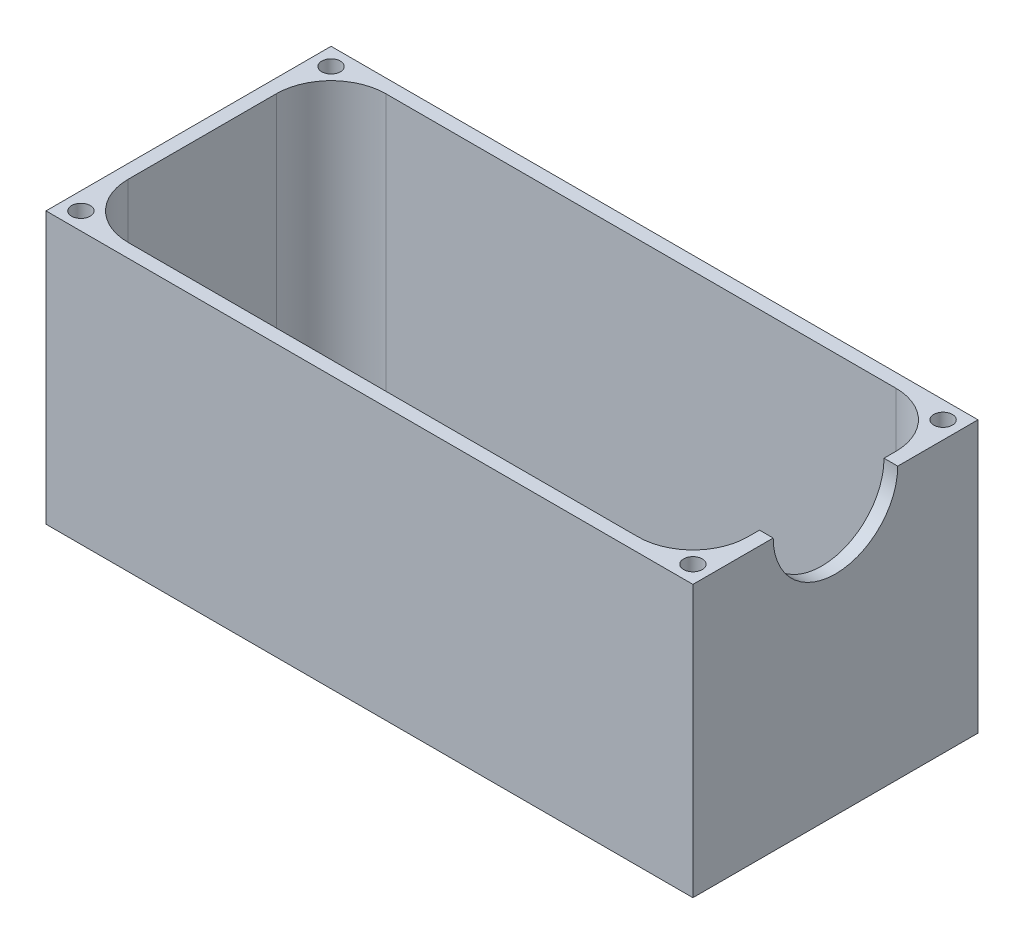
ISO-10303-21;
HEADER;
FILE_DESCRIPTION(('STEP AP214'),'2;1');
FILE_NAME('part.step','',(''),(''),'','','');
FILE_SCHEMA(('AUTOMOTIVE_DESIGN { 1 0 10303 214 1 1 1 1 }'));
ENDSEC;
DATA;
#1=APPLICATION_CONTEXT('core data for automotive mechanical design processes');
#2=APPLICATION_PROTOCOL_DEFINITION('international standard','automotive_design',2000,#1);
#3=PRODUCT_CONTEXT('',#1,'mechanical');
#4=PRODUCT('Part','Part','',(#3));
#5=PRODUCT_RELATED_PRODUCT_CATEGORY('part','',(#4));
#6=PRODUCT_DEFINITION_FORMATION('','',#4);
#7=PRODUCT_DEFINITION_CONTEXT('part definition',#1,'design');
#8=PRODUCT_DEFINITION('design','',#6,#7);
#9=PRODUCT_DEFINITION_SHAPE('','',#8);
#10=(LENGTH_UNIT() NAMED_UNIT(*) SI_UNIT(.MILLI.,.METRE.));
#11=(NAMED_UNIT(*) PLANE_ANGLE_UNIT() SI_UNIT($,.RADIAN.));
#12=(NAMED_UNIT(*) SI_UNIT($,.STERADIAN.) SOLID_ANGLE_UNIT());
#13=UNCERTAINTY_MEASURE_WITH_UNIT(LENGTH_MEASURE(1.E-05),#10,'distance_accuracy_value','');
#14=(GEOMETRIC_REPRESENTATION_CONTEXT(3) GLOBAL_UNCERTAINTY_ASSIGNED_CONTEXT((#13)) GLOBAL_UNIT_ASSIGNED_CONTEXT((#10,
#11,#12)) REPRESENTATION_CONTEXT('',''));
#15=CARTESIAN_POINT('',(0.,0.,0.));
#16=DIRECTION('',(0.,0.,1.));
#17=DIRECTION('',(1.,0.,0.));
#18=AXIS2_PLACEMENT_3D('',#15,#16,#17);
#19=CARTESIAN_POINT('',(0.,49.5,0.));
#20=DIRECTION('',(0.,1.,0.));
#21=DIRECTION('',(0.,0.,1.));
#22=AXIS2_PLACEMENT_3D('',#19,#20,#21);
#23=PLANE('',#22);
#24=CARTESIAN_POINT('',(-48.9246347305163,49.5,-29.3451864675237));
#25=DIRECTION('',(0.,-1.,0.));
#26=DIRECTION('',(0.,0.,-1.));
#27=AXIS2_PLACEMENT_3D('',#24,#25,#26);
#28=CIRCLE('',#27,1.7);
#29=CARTESIAN_POINT('',(-48.9246347305163,49.5,-31.0451864675237));
#30=VERTEX_POINT('',#29);
#31=EDGE_CURVE('E485',#30,#30,#28,.T.);
#32=ORIENTED_EDGE('',*,*,#31,.T.);
#33=EDGE_LOOP('',(#32));
#34=FACE_BOUND('',#33,.T.);
#35=CARTESIAN_POINT('',(-48.9246347305163,49.5,16.2908525017974));
#36=DIRECTION('',(0.,1.,0.));
#37=DIRECTION('',(0.,0.,1.));
#38=AXIS2_PLACEMENT_3D('',#35,#36,#37);
#39=CIRCLE('',#38,1.7);
#40=CARTESIAN_POINT('',(-48.9246347305163,49.5,17.9908525017974));
#41=VERTEX_POINT('',#40);
#42=EDGE_CURVE('E483',#41,#41,#39,.T.);
#43=ORIENTED_EDGE('',*,*,#42,.F.);
#44=EDGE_LOOP('',(#43));
#45=FACE_BOUND('',#44,.T.);
#46=DIRECTION('',(1.,0.,0.));
#47=VECTOR('',#46,1.);
#48=CARTESIAN_POINT('',(23.3933847541442,49.5,4.83194231702574));
#49=LINE('',#48,#47);
#50=CARTESIAN_POINT('',(63.3933847541442,49.5,4.83194231702574));
#51=VERTEX_POINT('',#50);
#52=CARTESIAN_POINT('',(65.8933847541443,49.5,4.83194231702574));
#53=VERTEX_POINT('',#52);
#54=EDGE_CURVE('E159',#51,#53,#49,.T.);
#55=ORIENTED_EDGE('',*,*,#54,.F.);
#56=DIRECTION('',(0.,0.,-1.));
#57=VECTOR('',#56,1.);
#58=CARTESIAN_POINT('',(63.3933847541442,49.5,-32.5271669828632));
#59=LINE('',#58,#57);
#60=CARTESIAN_POINT('',(63.3933847541442,49.5,6.97283301713683));
#61=VERTEX_POINT('',#60);
#62=EDGE_CURVE('E254',#61,#51,#59,.T.);
#63=ORIENTED_EDGE('',*,*,#62,.F.);
#64=CARTESIAN_POINT('',(53.3933847541442,49.5,6.97283301713683));
#65=DIRECTION('',(0.,1.,0.));
#66=DIRECTION('',(0.,0.,1.));
#67=AXIS2_PLACEMENT_3D('',#64,#65,#66);
#68=CIRCLE('',#67,10.);
#69=CARTESIAN_POINT('',(53.3933847541442,49.5,16.9728330171368));
#70=VERTEX_POINT('',#69);
#71=EDGE_CURVE('E235',#61,#70,#68,.F.);
#72=ORIENTED_EDGE('',*,*,#71,.T.);
#73=DIRECTION('',(1.,0.,0.));
#74=VECTOR('',#73,1.);
#75=CARTESIAN_POINT('',(-52.1066152458557,49.5,16.9728330171368));
#76=LINE('',#75,#74);
#77=CARTESIAN_POINT('',(-39.6066152458557,49.5,16.9728330171368));
#78=VERTEX_POINT('',#77);
#79=EDGE_CURVE('E335',#78,#70,#76,.T.);
#80=ORIENTED_EDGE('',*,*,#79,.F.);
#81=CARTESIAN_POINT('',(-39.6066152458557,49.5,6.97283301713683));
#82=DIRECTION('',(0.,1.,0.));
#83=DIRECTION('',(0.,0.,1.));
#84=AXIS2_PLACEMENT_3D('',#81,#82,#83);
#85=CIRCLE('',#84,10.);
#86=CARTESIAN_POINT('',(-49.6066152458557,49.5,6.97283301713683));
#87=VERTEX_POINT('',#86);
#88=EDGE_CURVE('E65',#78,#87,#85,.F.);
#89=ORIENTED_EDGE('',*,*,#88,.T.);
#90=DIRECTION('',(0.,0.,1.));
#91=VECTOR('',#90,1.);
#92=CARTESIAN_POINT('',(-49.6066152458557,49.5,-32.5271669828632));
#93=LINE('',#92,#91);
#94=CARTESIAN_POINT('',(-49.6066152458557,49.5,-20.0271669828632));
#95=VERTEX_POINT('',#94);
#96=EDGE_CURVE('E245',#95,#87,#93,.T.);
#97=ORIENTED_EDGE('',*,*,#96,.F.);
#98=CARTESIAN_POINT('',(-39.6066152458557,49.5,-20.0271669828632));
#99=DIRECTION('',(0.,1.,0.));
#100=DIRECTION('',(0.,0.,1.));
#101=AXIS2_PLACEMENT_3D('',#98,#99,#100);
#102=CIRCLE('',#101,10.);
#103=CARTESIAN_POINT('',(-39.6066152458557,49.5,-30.0271669828632));
#104=VERTEX_POINT('',#103);
#105=EDGE_CURVE('E239',#95,#104,#102,.F.);
#106=ORIENTED_EDGE('',*,*,#105,.T.);
#107=DIRECTION('',(-1.,0.,0.));
#108=VECTOR('',#107,1.);
#109=CARTESIAN_POINT('',(-52.1066152458557,49.5,-30.0271669828632));
#110=LINE('',#109,#108);
#111=CARTESIAN_POINT('',(53.3933847541442,49.5,-30.0271669828632));
#112=VERTEX_POINT('',#111);
#113=EDGE_CURVE('E243',#112,#104,#110,.T.);
#114=ORIENTED_EDGE('',*,*,#113,.F.);
#115=CARTESIAN_POINT('',(53.3933847541442,49.5,-20.0271669828632));
#116=DIRECTION('',(0.,1.,0.));
#117=DIRECTION('',(0.,0.,1.));
#118=AXIS2_PLACEMENT_3D('',#115,#116,#117);
#119=CIRCLE('',#118,10.);
#120=CARTESIAN_POINT('',(63.3933847541442,49.5,-20.0271669828632));
#121=VERTEX_POINT('',#120);
#122=EDGE_CURVE('E237',#112,#121,#119,.F.);
#123=ORIENTED_EDGE('',*,*,#122,.T.);
#124=CARTESIAN_POINT('',(63.3933847541442,49.5,-17.8862762827521));
#125=VERTEX_POINT('',#124);
#126=EDGE_CURVE('E172',#125,#121,#59,.T.);
#127=ORIENTED_EDGE('',*,*,#126,.F.);
#128=DIRECTION('',(1.,0.,0.));
#129=VECTOR('',#128,1.);
#130=CARTESIAN_POINT('',(23.3933847541442,49.5,-17.8862762827521));
#131=LINE('',#130,#129);
#132=CARTESIAN_POINT('',(65.8933847541443,49.5,-17.8862762827521));
#133=VERTEX_POINT('',#132);
#134=EDGE_CURVE('E71',#125,#133,#131,.T.);
#135=ORIENTED_EDGE('',*,*,#134,.T.);
#136=DIRECTION('',(0.,0.,-1.));
#137=VECTOR('',#136,1.);
#138=CARTESIAN_POINT('',(65.8933847541443,49.5,-32.5271669828632));
#139=LINE('',#138,#137);
#140=CARTESIAN_POINT('',(65.8933847541443,49.5,-32.5271669828632));
#141=VERTEX_POINT('',#140);
#142=EDGE_CURVE('E169',#133,#141,#139,.T.);
#143=ORIENTED_EDGE('',*,*,#142,.T.);
#144=DIRECTION('',(-1.,0.,0.));
#145=VECTOR('',#144,1.);
#146=CARTESIAN_POINT('',(-52.1066152458557,49.5,-32.5271669828632));
#147=LINE('',#146,#145);
#148=CARTESIAN_POINT('',(-52.1066152458557,49.5,-32.5271669828632));
#149=VERTEX_POINT('',#148);
#150=EDGE_CURVE('E181',#141,#149,#147,.T.);
#151=ORIENTED_EDGE('',*,*,#150,.T.);
#152=DIRECTION('',(0.,0.,1.));
#153=VECTOR('',#152,1.);
#154=CARTESIAN_POINT('',(-52.1066152458557,49.5,-32.5271669828632));
#155=LINE('',#154,#153);
#156=CARTESIAN_POINT('',(-52.1066152458557,49.5,19.4728330171368));
#157=VERTEX_POINT('',#156);
#158=EDGE_CURVE('E183',#149,#157,#155,.T.);
#159=ORIENTED_EDGE('',*,*,#158,.T.);
#160=DIRECTION('',(1.,0.,0.));
#161=VECTOR('',#160,1.);
#162=CARTESIAN_POINT('',(-52.1066152458557,49.5,19.4728330171368));
#163=LINE('',#162,#161);
#164=CARTESIAN_POINT('',(65.8933847541443,49.5,19.4728330171368));
#165=VERTEX_POINT('',#164);
#166=EDGE_CURVE('E179',#157,#165,#163,.T.);
#167=ORIENTED_EDGE('',*,*,#166,.T.);
#168=EDGE_CURVE('E178',#165,#53,#139,.T.);
#169=ORIENTED_EDGE('',*,*,#168,.T.);
#170=EDGE_LOOP('',(#55,#63,#72,#80,#89,#97,#106,#114,#123,#127,#135,#143,#151,#159,#167,#169));
#171=FACE_BOUND('',#170,.T.);
#172=CARTESIAN_POINT('',(62.7114042388048,49.5,-29.3451864675237));
#173=DIRECTION('',(0.,1.,0.));
#174=DIRECTION('',(0.,0.,1.));
#175=AXIS2_PLACEMENT_3D('',#172,#173,#174);
#176=CIRCLE('',#175,1.7);
#177=CARTESIAN_POINT('',(62.7114042388048,49.5,-27.6451864675237));
#178=VERTEX_POINT('',#177);
#179=EDGE_CURVE('E554',#178,#178,#176,.T.);
#180=ORIENTED_EDGE('',*,*,#179,.F.);
#181=EDGE_LOOP('',(#180));
#182=FACE_BOUND('',#181,.T.);
#183=CARTESIAN_POINT('',(62.7114042388048,49.5,16.2908525017974));
#184=DIRECTION('',(0.,-1.,0.));
#185=DIRECTION('',(0.,0.,-1.));
#186=AXIS2_PLACEMENT_3D('',#183,#184,#185);
#187=CIRCLE('',#186,1.7);
#188=CARTESIAN_POINT('',(62.7114042388048,49.5,14.5908525017974));
#189=VERTEX_POINT('',#188);
#190=EDGE_CURVE('E474',#189,#189,#187,.T.);
#191=ORIENTED_EDGE('',*,*,#190,.T.);
#192=EDGE_LOOP('',(#191));
#193=FACE_BOUND('',#192,.T.);
#194=ADVANCED_FACE('F57',(#34,#45,#171,#182,#193),#23,.T.);
#195=CARTESIAN_POINT('',(-52.1066152458557,2.5,-32.5271669828632));
#196=DIRECTION('',(1.,0.,0.));
#197=DIRECTION('',(0.,0.,-1.));
#198=AXIS2_PLACEMENT_3D('',#195,#196,#197);
#199=PLANE('',#198);
#200=DIRECTION('',(0.,0.,1.));
#201=VECTOR('',#200,1.);
#202=CARTESIAN_POINT('',(-52.1066152458557,0.,-32.5271669828632));
#203=LINE('',#202,#201);
#204=CARTESIAN_POINT('',(-52.1066152458557,0.,-32.5271669828632));
#205=VERTEX_POINT('',#204);
#206=CARTESIAN_POINT('',(-52.1066152458557,0.,19.4728330171368));
#207=VERTEX_POINT('',#206);
#208=EDGE_CURVE('E188',#205,#207,#203,.T.);
#209=ORIENTED_EDGE('',*,*,#208,.T.);
#210=DIRECTION('',(0.,-1.,0.));
#211=VECTOR('',#210,1.);
#212=CARTESIAN_POINT('',(-52.1066152458557,2.5,19.4728330171368));
#213=LINE('',#212,#211);
#214=EDGE_CURVE('E204',#157,#207,#213,.T.);
#215=ORIENTED_EDGE('',*,*,#214,.F.);
#216=ORIENTED_EDGE('',*,*,#158,.F.);
#217=DIRECTION('',(0.,-1.,0.));
#218=VECTOR('',#217,1.);
#219=CARTESIAN_POINT('',(-52.1066152458557,2.5,-32.5271669828632));
#220=LINE('',#219,#218);
#221=EDGE_CURVE('E197',#149,#205,#220,.T.);
#222=ORIENTED_EDGE('',*,*,#221,.T.);
#223=EDGE_LOOP('',(#209,#215,#216,#222));
#224=FACE_BOUND('',#223,.T.);
#225=ADVANCED_FACE('F280',(#224),#199,.F.);
#226=CARTESIAN_POINT('',(-52.1066152458557,2.5,19.4728330171368));
#227=DIRECTION('',(0.,0.,-1.));
#228=DIRECTION('',(-1.,0.,0.));
#229=AXIS2_PLACEMENT_3D('',#226,#227,#228);
#230=PLANE('',#229);
#231=DIRECTION('',(1.,0.,0.));
#232=VECTOR('',#231,1.);
#233=CARTESIAN_POINT('',(-52.1066152458557,0.,19.4728330171368));
#234=LINE('',#233,#232);
#235=CARTESIAN_POINT('',(65.8933847541443,0.,19.4728330171368));
#236=VERTEX_POINT('',#235);
#237=EDGE_CURVE('E191',#207,#236,#234,.T.);
#238=ORIENTED_EDGE('',*,*,#237,.T.);
#239=DIRECTION('',(0.,-1.,0.));
#240=VECTOR('',#239,1.);
#241=CARTESIAN_POINT('',(65.8933847541443,2.5,19.4728330171368));
#242=LINE('',#241,#240);
#243=EDGE_CURVE('E201',#165,#236,#242,.T.);
#244=ORIENTED_EDGE('',*,*,#243,.F.);
#245=ORIENTED_EDGE('',*,*,#166,.F.);
#246=ORIENTED_EDGE('',*,*,#214,.T.);
#247=EDGE_LOOP('',(#238,#244,#245,#246));
#248=FACE_BOUND('',#247,.T.);
#249=ADVANCED_FACE('F283',(#248),#230,.F.);
#250=CARTESIAN_POINT('',(65.8933847541443,2.5,-32.5271669828632));
#251=DIRECTION('',(-1.,0.,0.));
#252=DIRECTION('',(0.,0.,1.));
#253=AXIS2_PLACEMENT_3D('',#250,#251,#252);
#254=PLANE('',#253);
#255=ORIENTED_EDGE('',*,*,#142,.F.);
#256=CARTESIAN_POINT('',(65.8933847541443,49.5,-6.52716698286316));
#257=DIRECTION('',(1.,0.,0.));
#258=DIRECTION('',(0.,0.,1.));
#259=AXIS2_PLACEMENT_3D('',#256,#257,#258);
#260=CIRCLE('',#259,11.3591092998889);
#261=EDGE_CURVE('E156',#53,#133,#260,.T.);
#262=ORIENTED_EDGE('',*,*,#261,.F.);
#263=ORIENTED_EDGE('',*,*,#168,.F.);
#264=ORIENTED_EDGE('',*,*,#243,.T.);
#265=DIRECTION('',(0.,0.,-1.));
#266=VECTOR('',#265,1.);
#267=CARTESIAN_POINT('',(65.8933847541443,0.,-32.5271669828632));
#268=LINE('',#267,#266);
#269=CARTESIAN_POINT('',(65.8933847541443,0.,-32.5271669828632));
#270=VERTEX_POINT('',#269);
#271=EDGE_CURVE('E193',#236,#270,#268,.T.);
#272=ORIENTED_EDGE('',*,*,#271,.T.);
#273=DIRECTION('',(0.,-1.,0.));
#274=VECTOR('',#273,1.);
#275=CARTESIAN_POINT('',(65.8933847541443,2.5,-32.5271669828632));
#276=LINE('',#275,#274);
#277=EDGE_CURVE('E176',#141,#270,#276,.T.);
#278=ORIENTED_EDGE('',*,*,#277,.F.);
#279=EDGE_LOOP('',(#255,#262,#263,#264,#272,#278));
#280=FACE_BOUND('',#279,.T.);
#281=ADVANCED_FACE('F174',(#280),#254,.F.);
#282=CARTESIAN_POINT('',(-52.1066152458557,2.5,-32.5271669828632));
#283=DIRECTION('',(0.,0.,1.));
#284=DIRECTION('',(1.,0.,0.));
#285=AXIS2_PLACEMENT_3D('',#282,#283,#284);
#286=PLANE('',#285);
#287=DIRECTION('',(-1.,0.,0.));
#288=VECTOR('',#287,1.);
#289=CARTESIAN_POINT('',(-52.1066152458557,0.,-32.5271669828632));
#290=LINE('',#289,#288);
#291=EDGE_CURVE('E195',#270,#205,#290,.T.);
#292=ORIENTED_EDGE('',*,*,#291,.T.);
#293=ORIENTED_EDGE('',*,*,#221,.F.);
#294=ORIENTED_EDGE('',*,*,#150,.F.);
#295=ORIENTED_EDGE('',*,*,#277,.T.);
#296=EDGE_LOOP('',(#292,#293,#294,#295));
#297=FACE_BOUND('',#296,.T.);
#298=ADVANCED_FACE('F289',(#297),#286,.F.);
#299=CARTESIAN_POINT('',(0.,0.,0.));
#300=DIRECTION('',(0.,1.,0.));
#301=DIRECTION('',(0.,0.,1.));
#302=AXIS2_PLACEMENT_3D('',#299,#300,#301);
#303=PLANE('',#302);
#304=ORIENTED_EDGE('',*,*,#208,.F.);
#305=ORIENTED_EDGE('',*,*,#291,.F.);
#306=ORIENTED_EDGE('',*,*,#271,.F.);
#307=ORIENTED_EDGE('',*,*,#237,.F.);
#308=EDGE_LOOP('',(#304,#305,#306,#307));
#309=FACE_BOUND('',#308,.T.);
#310=ADVANCED_FACE('F287',(#309),#303,.F.);
#311=CARTESIAN_POINT('',(-49.6066152458557,49.5,-32.5271669828632));
#312=DIRECTION('',(1.,0.,0.));
#313=DIRECTION('',(0.,0.,-1.));
#314=AXIS2_PLACEMENT_3D('',#311,#312,#313);
#315=PLANE('',#314);
#316=DIRECTION('',(0.,0.,1.));
#317=VECTOR('',#316,1.);
#318=CARTESIAN_POINT('',(-49.6066152458557,2.5,-32.5271669828632));
#319=LINE('',#318,#317);
#320=CARTESIAN_POINT('',(-49.6066152458557,2.5,-20.0271669828632));
#321=VERTEX_POINT('',#320);
#322=CARTESIAN_POINT('',(-49.6066152458557,2.5,6.97283301713683));
#323=VERTEX_POINT('',#322);
#324=EDGE_CURVE('E262',#321,#323,#319,.T.);
#325=ORIENTED_EDGE('',*,*,#324,.F.);
#326=DIRECTION('',(0.,-1.,0.));
#327=VECTOR('',#326,1.);
#328=CARTESIAN_POINT('',(-49.6066152458557,49.5,-20.0271669828632));
#329=LINE('',#328,#327);
#330=EDGE_CURVE('E233',#321,#95,#329,.F.);
#331=ORIENTED_EDGE('',*,*,#330,.T.);
#332=ORIENTED_EDGE('',*,*,#96,.T.);
#333=DIRECTION('',(0.,-1.,0.));
#334=VECTOR('',#333,1.);
#335=CARTESIAN_POINT('',(-49.6066152458557,2.5,6.97283301713683));
#336=LINE('',#335,#334);
#337=EDGE_CURVE('E230',#87,#323,#336,.T.);
#338=ORIENTED_EDGE('',*,*,#337,.T.);
#339=EDGE_LOOP('',(#325,#331,#332,#338));
#340=FACE_BOUND('',#339,.T.);
#341=ADVANCED_FACE('F265',(#340),#315,.T.);
#342=CARTESIAN_POINT('',(-52.1066152458557,49.5,16.9728330171368));
#343=DIRECTION('',(0.,0.,-1.));
#344=DIRECTION('',(-1.,0.,0.));
#345=AXIS2_PLACEMENT_3D('',#342,#343,#344);
#346=PLANE('',#345);
#347=ORIENTED_EDGE('',*,*,#79,.T.);
#348=DIRECTION('',(0.,-1.,0.));
#349=VECTOR('',#348,1.);
#350=CARTESIAN_POINT('',(53.3933847541442,2.5,16.9728330171368));
#351=LINE('',#350,#349);
#352=CARTESIAN_POINT('',(53.3933847541442,2.5,16.9728330171368));
#353=VERTEX_POINT('',#352);
#354=EDGE_CURVE('E209',#70,#353,#351,.T.);
#355=ORIENTED_EDGE('',*,*,#354,.T.);
#356=DIRECTION('',(1.,0.,0.));
#357=VECTOR('',#356,1.);
#358=CARTESIAN_POINT('',(-52.1066152458557,2.5,16.9728330171368));
#359=LINE('',#358,#357);
#360=CARTESIAN_POINT('',(-39.6066152458557,2.5,16.9728330171368));
#361=VERTEX_POINT('',#360);
#362=EDGE_CURVE('E267',#361,#353,#359,.T.);
#363=ORIENTED_EDGE('',*,*,#362,.F.);
#364=DIRECTION('',(0.,-1.,0.));
#365=VECTOR('',#364,1.);
#366=CARTESIAN_POINT('',(-39.6066152458557,49.5,16.9728330171368));
#367=LINE('',#366,#365);
#368=EDGE_CURVE('E207',#361,#78,#367,.F.);
#369=ORIENTED_EDGE('',*,*,#368,.T.);
#370=EDGE_LOOP('',(#347,#355,#363,#369));
#371=FACE_BOUND('',#370,.T.);
#372=ADVANCED_FACE('F324',(#371),#346,.T.);
#373=CARTESIAN_POINT('',(63.3933847541442,49.5,-32.5271669828632));
#374=DIRECTION('',(-1.,0.,0.));
#375=DIRECTION('',(0.,0.,1.));
#376=AXIS2_PLACEMENT_3D('',#373,#374,#375);
#377=PLANE('',#376);
#378=CARTESIAN_POINT('',(63.3933847541442,49.5,-6.52716698286316));
#379=DIRECTION('',(-1.,0.,0.));
#380=DIRECTION('',(0.,0.,1.));
#381=AXIS2_PLACEMENT_3D('',#378,#379,#380);
#382=CIRCLE('',#381,11.3591092998889);
#383=EDGE_CURVE('E12',#125,#51,#382,.T.);
#384=ORIENTED_EDGE('',*,*,#383,.F.);
#385=ORIENTED_EDGE('',*,*,#126,.T.);
#386=DIRECTION('',(0.,-1.,0.));
#387=VECTOR('',#386,1.);
#388=CARTESIAN_POINT('',(63.3933847541442,2.5,-20.0271669828632));
#389=LINE('',#388,#387);
#390=CARTESIAN_POINT('',(63.3933847541442,2.5,-20.0271669828632));
#391=VERTEX_POINT('',#390);
#392=EDGE_CURVE('E220',#121,#391,#389,.T.);
#393=ORIENTED_EDGE('',*,*,#392,.T.);
#394=DIRECTION('',(0.,0.,-1.));
#395=VECTOR('',#394,1.);
#396=CARTESIAN_POINT('',(63.3933847541442,2.5,-32.5271669828632));
#397=LINE('',#396,#395);
#398=CARTESIAN_POINT('',(63.3933847541442,2.5,6.97283301713683));
#399=VERTEX_POINT('',#398);
#400=EDGE_CURVE('E269',#399,#391,#397,.T.);
#401=ORIENTED_EDGE('',*,*,#400,.F.);
#402=DIRECTION('',(0.,-1.,0.));
#403=VECTOR('',#402,1.);
#404=CARTESIAN_POINT('',(63.3933847541442,49.5,6.97283301713683));
#405=LINE('',#404,#403);
#406=EDGE_CURVE('E223',#399,#61,#405,.F.);
#407=ORIENTED_EDGE('',*,*,#406,.T.);
#408=ORIENTED_EDGE('',*,*,#62,.T.);
#409=EDGE_LOOP('',(#384,#385,#393,#401,#407,#408));
#410=FACE_BOUND('',#409,.T.);
#411=ADVANCED_FACE('F319',(#410),#377,.T.);
#412=CARTESIAN_POINT('',(-52.1066152458557,49.5,-30.0271669828632));
#413=DIRECTION('',(0.,0.,1.));
#414=DIRECTION('',(1.,0.,0.));
#415=AXIS2_PLACEMENT_3D('',#412,#413,#414);
#416=PLANE('',#415);
#417=DIRECTION('',(-1.,0.,0.));
#418=VECTOR('',#417,1.);
#419=CARTESIAN_POINT('',(-52.1066152458557,2.5,-30.0271669828632));
#420=LINE('',#419,#418);
#421=CARTESIAN_POINT('',(53.3933847541442,2.5,-30.0271669828632));
#422=VERTEX_POINT('',#421);
#423=CARTESIAN_POINT('',(-39.6066152458557,2.5,-30.0271669828632));
#424=VERTEX_POINT('',#423);
#425=EDGE_CURVE('E263',#422,#424,#420,.T.);
#426=ORIENTED_EDGE('',*,*,#425,.F.);
#427=DIRECTION('',(0.,-1.,0.));
#428=VECTOR('',#427,1.);
#429=CARTESIAN_POINT('',(53.3933847541442,49.5,-30.0271669828632));
#430=LINE('',#429,#428);
#431=EDGE_CURVE('E228',#422,#112,#430,.F.);
#432=ORIENTED_EDGE('',*,*,#431,.T.);
#433=ORIENTED_EDGE('',*,*,#113,.T.);
#434=DIRECTION('',(0.,-1.,0.));
#435=VECTOR('',#434,1.);
#436=CARTESIAN_POINT('',(-39.6066152458557,2.5,-30.0271669828632));
#437=LINE('',#436,#435);
#438=EDGE_CURVE('E225',#104,#424,#437,.T.);
#439=ORIENTED_EDGE('',*,*,#438,.T.);
#440=EDGE_LOOP('',(#426,#432,#433,#439));
#441=FACE_BOUND('',#440,.T.);
#442=ADVANCED_FACE('F251',(#441),#416,.T.);
#443=CARTESIAN_POINT('',(0.,2.5,0.));
#444=DIRECTION('',(0.,1.,0.));
#445=DIRECTION('',(0.,0.,1.));
#446=AXIS2_PLACEMENT_3D('',#443,#444,#445);
#447=PLANE('',#446);
#448=ORIENTED_EDGE('',*,*,#362,.T.);
#449=CARTESIAN_POINT('',(53.3933847541442,2.5,6.97283301713683));
#450=DIRECTION('',(0.,1.,0.));
#451=DIRECTION('',(0.,0.,1.));
#452=AXIS2_PLACEMENT_3D('',#449,#450,#451);
#453=CIRCLE('',#452,10.);
#454=EDGE_CURVE('E218',#353,#399,#453,.T.);
#455=ORIENTED_EDGE('',*,*,#454,.T.);
#456=ORIENTED_EDGE('',*,*,#400,.T.);
#457=CARTESIAN_POINT('',(53.3933847541442,2.5,-20.0271669828632));
#458=DIRECTION('',(0.,1.,0.));
#459=DIRECTION('',(0.,0.,1.));
#460=AXIS2_PLACEMENT_3D('',#457,#458,#459);
#461=CIRCLE('',#460,10.);
#462=EDGE_CURVE('E216',#391,#422,#461,.T.);
#463=ORIENTED_EDGE('',*,*,#462,.T.);
#464=ORIENTED_EDGE('',*,*,#425,.T.);
#465=CARTESIAN_POINT('',(-39.6066152458557,2.5,-20.0271669828632));
#466=DIRECTION('',(0.,1.,0.));
#467=DIRECTION('',(0.,0.,1.));
#468=AXIS2_PLACEMENT_3D('',#465,#466,#467);
#469=CIRCLE('',#468,10.);
#470=EDGE_CURVE('E214',#424,#321,#469,.T.);
#471=ORIENTED_EDGE('',*,*,#470,.T.);
#472=ORIENTED_EDGE('',*,*,#324,.T.);
#473=CARTESIAN_POINT('',(-39.6066152458557,2.5,6.97283301713683));
#474=DIRECTION('',(0.,1.,0.));
#475=DIRECTION('',(0.,0.,1.));
#476=AXIS2_PLACEMENT_3D('',#473,#474,#475);
#477=CIRCLE('',#476,10.);
#478=EDGE_CURVE('E212',#323,#361,#477,.T.);
#479=ORIENTED_EDGE('',*,*,#478,.T.);
#480=EDGE_LOOP('',(#448,#455,#456,#463,#464,#471,#472,#479));
#481=FACE_BOUND('',#480,.T.);
#482=ADVANCED_FACE('F261',(#481),#447,.T.);
#483=CARTESIAN_POINT('',(53.3933847541442,49.5,6.97283301713683));
#484=DIRECTION('',(0.,1.,0.));
#485=DIRECTION('',(0.,0.,1.));
#486=AXIS2_PLACEMENT_3D('',#483,#484,#485);
#487=CYLINDRICAL_SURFACE('',#486,10.);
#488=ORIENTED_EDGE('',*,*,#71,.F.);
#489=ORIENTED_EDGE('',*,*,#406,.F.);
#490=ORIENTED_EDGE('',*,*,#454,.F.);
#491=ORIENTED_EDGE('',*,*,#354,.F.);
#492=EDGE_LOOP('',(#488,#489,#490,#491));
#493=FACE_BOUND('',#492,.T.);
#494=ADVANCED_FACE('F311',(#493),#487,.F.);
#495=CARTESIAN_POINT('',(53.3933847541442,49.5,-20.0271669828632));
#496=DIRECTION('',(0.,1.,0.));
#497=DIRECTION('',(0.,0.,1.));
#498=AXIS2_PLACEMENT_3D('',#495,#496,#497);
#499=CYLINDRICAL_SURFACE('',#498,10.);
#500=ORIENTED_EDGE('',*,*,#122,.F.);
#501=ORIENTED_EDGE('',*,*,#431,.F.);
#502=ORIENTED_EDGE('',*,*,#462,.F.);
#503=ORIENTED_EDGE('',*,*,#392,.F.);
#504=EDGE_LOOP('',(#500,#501,#502,#503));
#505=FACE_BOUND('',#504,.T.);
#506=ADVANCED_FACE('F316',(#505),#499,.F.);
#507=CARTESIAN_POINT('',(-39.6066152458557,49.5,-20.0271669828632));
#508=DIRECTION('',(0.,1.,0.));
#509=DIRECTION('',(0.,0.,1.));
#510=AXIS2_PLACEMENT_3D('',#507,#508,#509);
#511=CYLINDRICAL_SURFACE('',#510,10.);
#512=ORIENTED_EDGE('',*,*,#105,.F.);
#513=ORIENTED_EDGE('',*,*,#330,.F.);
#514=ORIENTED_EDGE('',*,*,#470,.F.);
#515=ORIENTED_EDGE('',*,*,#438,.F.);
#516=EDGE_LOOP('',(#512,#513,#514,#515));
#517=FACE_BOUND('',#516,.T.);
#518=ADVANCED_FACE('F256',(#517),#511,.F.);
#519=CARTESIAN_POINT('',(-39.6066152458557,49.5,6.97283301713683));
#520=DIRECTION('',(0.,1.,0.));
#521=DIRECTION('',(0.,0.,1.));
#522=AXIS2_PLACEMENT_3D('',#519,#520,#521);
#523=CYLINDRICAL_SURFACE('',#522,10.);
#524=ORIENTED_EDGE('',*,*,#88,.F.);
#525=ORIENTED_EDGE('',*,*,#368,.F.);
#526=ORIENTED_EDGE('',*,*,#478,.F.);
#527=ORIENTED_EDGE('',*,*,#337,.F.);
#528=EDGE_LOOP('',(#524,#525,#526,#527));
#529=FACE_BOUND('',#528,.T.);
#530=ADVANCED_FACE('F59',(#529),#523,.F.);
#531=CARTESIAN_POINT('',(23.3933847541442,49.5,-6.52716698286316));
#532=DIRECTION('',(1.,0.,0.));
#533=DIRECTION('',(0.,0.,-1.));
#534=AXIS2_PLACEMENT_3D('',#531,#532,#533);
#535=CYLINDRICAL_SURFACE('',#534,11.3591092998889);
#536=ORIENTED_EDGE('',*,*,#383,.T.);
#537=ORIENTED_EDGE('',*,*,#54,.T.);
#538=ORIENTED_EDGE('',*,*,#261,.T.);
#539=ORIENTED_EDGE('',*,*,#134,.F.);
#540=EDGE_LOOP('',(#536,#537,#538,#539));
#541=FACE_BOUND('',#540,.T.);
#542=ADVANCED_FACE('F157',(#541),#535,.F.);
#543=CARTESIAN_POINT('',(-48.9246347305163,43.5,16.2908525017974));
#544=DIRECTION('',(0.,1.,0.));
#545=DIRECTION('',(0.,0.,1.));
#546=AXIS2_PLACEMENT_3D('',#543,#544,#545);
#547=CYLINDRICAL_SURFACE('',#546,1.7);
#548=CARTESIAN_POINT('',(-48.9246347305163,43.5,16.2908525017974));
#549=DIRECTION('',(0.,1.,0.));
#550=DIRECTION('',(0.,0.,1.));
#551=AXIS2_PLACEMENT_3D('',#548,#549,#550);
#552=CIRCLE('',#551,1.7);
#553=CARTESIAN_POINT('',(-48.9246347305163,43.5,17.9908525017974));
#554=VERTEX_POINT('',#553);
#555=EDGE_CURVE('E164',#554,#554,#552,.T.);
#556=ORIENTED_EDGE('',*,*,#555,.F.);
#557=EDGE_LOOP('',(#556));
#558=FACE_BOUND('',#557,.T.);
#559=ORIENTED_EDGE('',*,*,#42,.T.);
#560=EDGE_LOOP('',(#559));
#561=FACE_BOUND('',#560,.T.);
#562=ADVANCED_FACE('F385',(#558,#561),#547,.F.);
#563=CARTESIAN_POINT('',(-48.9246347305163,43.5,16.2908525017974));
#564=DIRECTION('',(0.,1.,0.));
#565=DIRECTION('',(0.,0.,1.));
#566=AXIS2_PLACEMENT_3D('',#563,#564,#565);
#567=PLANE('',#566);
#568=ORIENTED_EDGE('',*,*,#555,.T.);
#569=EDGE_LOOP('',(#568));
#570=FACE_BOUND('',#569,.T.);
#571=ADVANCED_FACE('F398',(#570),#567,.T.);
#572=CARTESIAN_POINT('',(-48.9246347305163,43.5,-29.3451864675237));
#573=DIRECTION('',(0.,1.,0.));
#574=DIRECTION('',(0.,0.,1.));
#575=AXIS2_PLACEMENT_3D('',#572,#573,#574);
#576=CYLINDRICAL_SURFACE('',#575,1.7);
#577=CARTESIAN_POINT('',(-48.9246347305163,43.5,-29.3451864675237));
#578=DIRECTION('',(0.,-1.,0.));
#579=DIRECTION('',(0.,0.,-1.));
#580=AXIS2_PLACEMENT_3D('',#577,#578,#579);
#581=CIRCLE('',#580,1.7);
#582=CARTESIAN_POINT('',(-48.9246347305163,43.5,-31.0451864675237));
#583=VERTEX_POINT('',#582);
#584=EDGE_CURVE('E550',#583,#583,#581,.T.);
#585=ORIENTED_EDGE('',*,*,#584,.T.);
#586=EDGE_LOOP('',(#585));
#587=FACE_BOUND('',#586,.T.);
#588=ORIENTED_EDGE('',*,*,#31,.F.);
#589=EDGE_LOOP('',(#588));
#590=FACE_BOUND('',#589,.T.);
#591=ADVANCED_FACE('F407',(#587,#590),#576,.F.);
#592=CARTESIAN_POINT('',(-48.9246347305163,43.5,-29.3451864675237));
#593=DIRECTION('',(0.,-1.,0.));
#594=DIRECTION('',(0.,0.,-1.));
#595=AXIS2_PLACEMENT_3D('',#592,#593,#594);
#596=PLANE('',#595);
#597=ORIENTED_EDGE('',*,*,#584,.F.);
#598=EDGE_LOOP('',(#597));
#599=FACE_BOUND('',#598,.T.);
#600=ADVANCED_FACE('F417',(#599),#596,.F.);
#601=CARTESIAN_POINT('',(62.7114042388048,43.5,-29.3451864675237));
#602=DIRECTION('',(0.,1.,0.));
#603=DIRECTION('',(0.,0.,1.));
#604=AXIS2_PLACEMENT_3D('',#601,#602,#603);
#605=CYLINDRICAL_SURFACE('',#604,1.7);
#606=CARTESIAN_POINT('',(62.7114042388048,43.5,-29.3451864675237));
#607=DIRECTION('',(0.,1.,0.));
#608=DIRECTION('',(0.,0.,1.));
#609=AXIS2_PLACEMENT_3D('',#606,#607,#608);
#610=CIRCLE('',#609,1.7);
#611=CARTESIAN_POINT('',(62.7114042388048,43.5,-27.6451864675237));
#612=VERTEX_POINT('',#611);
#613=EDGE_CURVE('E477',#612,#612,#610,.T.);
#614=ORIENTED_EDGE('',*,*,#613,.F.);
#615=EDGE_LOOP('',(#614));
#616=FACE_BOUND('',#615,.T.);
#617=ORIENTED_EDGE('',*,*,#179,.T.);
#618=EDGE_LOOP('',(#617));
#619=FACE_BOUND('',#618,.T.);
#620=ADVANCED_FACE('F427',(#616,#619),#605,.F.);
#621=CARTESIAN_POINT('',(62.7114042388048,43.5,-29.3451864675237));
#622=DIRECTION('',(0.,1.,0.));
#623=DIRECTION('',(0.,0.,1.));
#624=AXIS2_PLACEMENT_3D('',#621,#622,#623);
#625=PLANE('',#624);
#626=ORIENTED_EDGE('',*,*,#613,.T.);
#627=EDGE_LOOP('',(#626));
#628=FACE_BOUND('',#627,.T.);
#629=ADVANCED_FACE('F437',(#628),#625,.T.);
#630=CARTESIAN_POINT('',(62.7114042388048,43.5,16.2908525017974));
#631=DIRECTION('',(0.,1.,0.));
#632=DIRECTION('',(0.,0.,1.));
#633=AXIS2_PLACEMENT_3D('',#630,#631,#632);
#634=CYLINDRICAL_SURFACE('',#633,1.7);
#635=CARTESIAN_POINT('',(62.7114042388048,43.5,16.2908525017974));
#636=DIRECTION('',(0.,-1.,0.));
#637=DIRECTION('',(0.,0.,-1.));
#638=AXIS2_PLACEMENT_3D('',#635,#636,#637);
#639=CIRCLE('',#638,1.7);
#640=CARTESIAN_POINT('',(62.7114042388048,43.5,14.5908525017974));
#641=VERTEX_POINT('',#640);
#642=EDGE_CURVE('E473',#641,#641,#639,.T.);
#643=ORIENTED_EDGE('',*,*,#642,.T.);
#644=EDGE_LOOP('',(#643));
#645=FACE_BOUND('',#644,.T.);
#646=ORIENTED_EDGE('',*,*,#190,.F.);
#647=EDGE_LOOP('',(#646));
#648=FACE_BOUND('',#647,.T.);
#649=ADVANCED_FACE('F447',(#645,#648),#634,.F.);
#650=CARTESIAN_POINT('',(62.7114042388048,43.5,16.2908525017974));
#651=DIRECTION('',(0.,-1.,0.));
#652=DIRECTION('',(0.,0.,-1.));
#653=AXIS2_PLACEMENT_3D('',#650,#651,#652);
#654=PLANE('',#653);
#655=ORIENTED_EDGE('',*,*,#642,.F.);
#656=EDGE_LOOP('',(#655));
#657=FACE_BOUND('',#656,.T.);
#658=ADVANCED_FACE('F457',(#657),#654,.F.);
#659=CLOSED_SHELL('',(#194,#225,#249,#281,#298,#310,#341,#372,#411,#442,#482,#494,#506,#518,
#530,#542,#562,#571,#591,#600,#620,#629,#649,#658));
#660=MANIFOLD_SOLID_BREP('B2',#659);
#661=ADVANCED_BREP_SHAPE_REPRESENTATION('',(#18,#660),#14);
#662=SHAPE_DEFINITION_REPRESENTATION(#9,#661);
ENDSEC;
END-ISO-10303-21;
